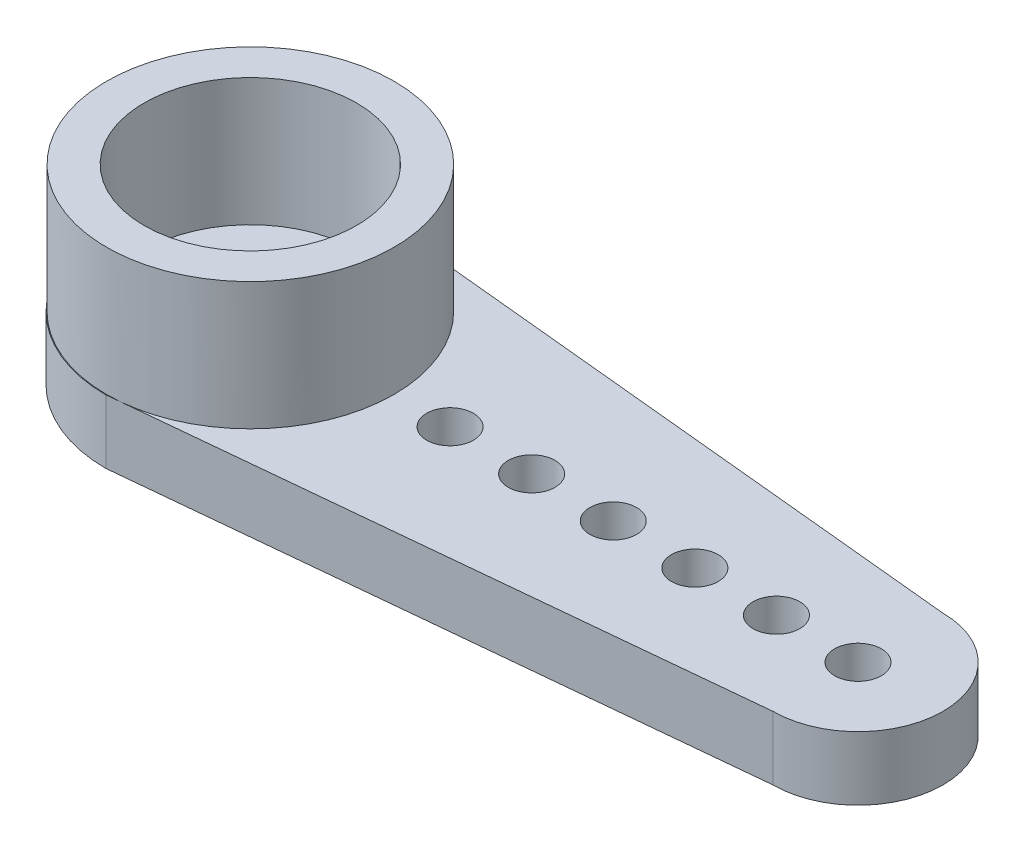
ISO-10303-21;
HEADER;
FILE_DESCRIPTION(('STEP AP214'),'2;1');
FILE_NAME('part.step','',(''),(''),'','','');
FILE_SCHEMA(('AUTOMOTIVE_DESIGN { 1 0 10303 214 1 1 1 1 }'));
ENDSEC;
DATA;
#1=APPLICATION_CONTEXT('core data for automotive mechanical design processes');
#2=APPLICATION_PROTOCOL_DEFINITION('international standard','automotive_design',2000,#1);
#3=PRODUCT_CONTEXT('',#1,'mechanical');
#4=PRODUCT('Part','Part','',(#3));
#5=PRODUCT_RELATED_PRODUCT_CATEGORY('part','',(#4));
#6=PRODUCT_DEFINITION_FORMATION('','',#4);
#7=PRODUCT_DEFINITION_CONTEXT('part definition',#1,'design');
#8=PRODUCT_DEFINITION('design','',#6,#7);
#9=PRODUCT_DEFINITION_SHAPE('','',#8);
#10=(LENGTH_UNIT() NAMED_UNIT(*) SI_UNIT(.MILLI.,.METRE.));
#11=(NAMED_UNIT(*) PLANE_ANGLE_UNIT() SI_UNIT($,.RADIAN.));
#12=(NAMED_UNIT(*) SI_UNIT($,.STERADIAN.) SOLID_ANGLE_UNIT());
#13=UNCERTAINTY_MEASURE_WITH_UNIT(LENGTH_MEASURE(1.E-05),#10,'distance_accuracy_value','');
#14=(GEOMETRIC_REPRESENTATION_CONTEXT(3) GLOBAL_UNCERTAINTY_ASSIGNED_CONTEXT((#13)) GLOBAL_UNIT_ASSIGNED_CONTEXT((#10,
#11,#12)) REPRESENTATION_CONTEXT('',''));
#15=CARTESIAN_POINT('',(0.,0.,0.));
#16=DIRECTION('',(0.,0.,1.));
#17=DIRECTION('',(1.,0.,0.));
#18=AXIS2_PLACEMENT_3D('',#15,#16,#17);
#19=CARTESIAN_POINT('',(-23.9406547992216,1.66417194875298,0.));
#20=DIRECTION('',(0.,1.,0.));
#21=DIRECTION('',(0.,0.,1.));
#22=AXIS2_PLACEMENT_3D('',#19,#20,#21);
#23=PLANE('',#22);
#24=CARTESIAN_POINT('',(5.26253029269123,1.66417194875298,0.));
#25=DIRECTION('',(0.,1.,0.));
#26=DIRECTION('',(0.,0.,1.));
#27=AXIS2_PLACEMENT_3D('',#24,#25,#26);
#28=CIRCLE('',#27,1.1);
#29=CARTESIAN_POINT('',(5.26253029269123,1.66417194875298,1.10000000000001));
#30=VERTEX_POINT('',#29);
#31=EDGE_CURVE('E306',#30,#30,#28,.T.);
#32=ORIENTED_EDGE('',*,*,#31,.F.);
#33=EDGE_LOOP('',(#32));
#34=FACE_BOUND('',#33,.T.);
#35=CARTESIAN_POINT('',(9.10253029269123,1.66417194875298,0.));
#36=DIRECTION('',(0.,1.,0.));
#37=DIRECTION('',(0.,0.,1.));
#38=AXIS2_PLACEMENT_3D('',#35,#36,#37);
#39=CIRCLE('',#38,1.1);
#40=CARTESIAN_POINT('',(9.10253029269123,1.66417194875298,1.1));
#41=VERTEX_POINT('',#40);
#42=EDGE_CURVE('E311',#41,#41,#39,.T.);
#43=ORIENTED_EDGE('',*,*,#42,.F.);
#44=EDGE_LOOP('',(#43));
#45=FACE_BOUND('',#44,.T.);
#46=CARTESIAN_POINT('',(12.9425302926912,1.66417194875298,0.));
#47=DIRECTION('',(0.,1.,0.));
#48=DIRECTION('',(0.,0.,1.));
#49=AXIS2_PLACEMENT_3D('',#46,#47,#48);
#50=CIRCLE('',#49,1.1);
#51=CARTESIAN_POINT('',(12.9425302926912,1.66417194875298,1.1));
#52=VERTEX_POINT('',#51);
#53=EDGE_CURVE('E315',#52,#52,#50,.T.);
#54=ORIENTED_EDGE('',*,*,#53,.F.);
#55=EDGE_LOOP('',(#54));
#56=FACE_BOUND('',#55,.T.);
#57=CARTESIAN_POINT('',(16.7825302926912,1.66417194875298,0.));
#58=DIRECTION('',(0.,1.,0.));
#59=DIRECTION('',(0.,0.,1.));
#60=AXIS2_PLACEMENT_3D('',#57,#58,#59);
#61=CIRCLE('',#60,1.1);
#62=CARTESIAN_POINT('',(16.7825302926912,1.66417194875298,1.1));
#63=VERTEX_POINT('',#62);
#64=EDGE_CURVE('E319',#63,#63,#61,.T.);
#65=ORIENTED_EDGE('',*,*,#64,.F.);
#66=EDGE_LOOP('',(#65));
#67=FACE_BOUND('',#66,.T.);
#68=CARTESIAN_POINT('',(20.6225302926912,1.66417194875298,0.));
#69=DIRECTION('',(0.,1.,0.));
#70=DIRECTION('',(0.,0.,1.));
#71=AXIS2_PLACEMENT_3D('',#68,#69,#70);
#72=CIRCLE('',#71,1.1);
#73=CARTESIAN_POINT('',(20.6225302926912,1.66417194875298,1.1));
#74=VERTEX_POINT('',#73);
#75=EDGE_CURVE('E323',#74,#74,#72,.T.);
#76=ORIENTED_EDGE('',*,*,#75,.F.);
#77=EDGE_LOOP('',(#76));
#78=FACE_BOUND('',#77,.T.);
#79=CARTESIAN_POINT('',(24.4625302926912,1.66417194875298,0.));
#80=DIRECTION('',(0.,1.,0.));
#81=DIRECTION('',(0.,0.,1.));
#82=AXIS2_PLACEMENT_3D('',#79,#80,#81);
#83=CIRCLE('',#82,1.1);
#84=CARTESIAN_POINT('',(24.4625302926912,1.66417194875298,1.1));
#85=VERTEX_POINT('',#84);
#86=EDGE_CURVE('E195',#85,#85,#83,.T.);
#87=ORIENTED_EDGE('',*,*,#86,.F.);
#88=EDGE_LOOP('',(#87));
#89=FACE_BOUND('',#88,.T.);
#90=CARTESIAN_POINT('',(-4.13746970730877,1.66417194875298,0.));
#91=DIRECTION('',(0.,1.,0.));
#92=DIRECTION('',(0.,0.,1.));
#93=AXIS2_PLACEMENT_3D('',#90,#91,#92);
#94=CIRCLE('',#93,6.76764401918097);
#95=CARTESIAN_POINT('',(-3.47805580563766,1.66417194875298,6.7354419956406));
#96=VERTEX_POINT('',#95);
#97=CARTESIAN_POINT('',(-3.47805580563766,1.66417194875298,-6.7354419956406));
#98=VERTEX_POINT('',#97);
#99=EDGE_CURVE('E97',#96,#98,#94,.T.);
#100=ORIENTED_EDGE('',*,*,#99,.F.);
#101=DIRECTION('',(0.995241767526614,0.,-0.0974362569606475));
#102=VECTOR('',#101,1.);
#103=CARTESIAN_POINT('',(-23.093232940272,1.66417194875298,8.65580898784256));
#104=LINE('',#103,#102);
#105=CARTESIAN_POINT('',(24.4625302926912,1.66417194875298,4.));
#106=VERTEX_POINT('',#105);
#107=EDGE_CURVE('E85',#96,#106,#104,.T.);
#108=ORIENTED_EDGE('',*,*,#107,.T.);
#109=CARTESIAN_POINT('',(24.4625302926912,1.66417194875298,0.));
#110=DIRECTION('',(0.,1.,0.));
#111=DIRECTION('',(0.,0.,1.));
#112=AXIS2_PLACEMENT_3D('',#109,#110,#111);
#113=CIRCLE('',#112,4.);
#114=CARTESIAN_POINT('',(24.4625302926912,1.66417194875298,-3.99999999999999));
#115=VERTEX_POINT('',#114);
#116=EDGE_CURVE('E93',#106,#115,#113,.T.);
#117=ORIENTED_EDGE('',*,*,#116,.T.);
#118=DIRECTION('',(0.995241767526614,0.,0.0974362569606479));
#119=VECTOR('',#118,1.);
#120=CARTESIAN_POINT('',(-23.093232940272,1.66417194875298,-8.65580898784256));
#121=LINE('',#120,#119);
#122=EDGE_CURVE('E98',#98,#115,#121,.T.);
#123=ORIENTED_EDGE('',*,*,#122,.F.);
#124=EDGE_LOOP('',(#100,#108,#117,#123));
#125=FACE_BOUND('',#124,.T.);
#126=ADVANCED_FACE('F35',(#34,#45,#56,#67,#78,#89,#125),#23,.T.);
#127=CARTESIAN_POINT('',(-23.093232940272,1.66417194875298,8.65580898784256));
#128=DIRECTION('',(-0.0974362569606475,0.,-0.995241767526614));
#129=DIRECTION('',(-0.995241767526614,0.,0.0974362569606475));
#130=AXIS2_PLACEMENT_3D('',#127,#128,#129);
#131=PLANE('',#130);
#132=ORIENTED_EDGE('',*,*,#107,.F.);
#133=CARTESIAN_POINT('',(-4.13746970730877,1.66417194875298,6.8));
#134=VERTEX_POINT('',#133);
#135=EDGE_CURVE('E90',#134,#96,#104,.T.);
#136=ORIENTED_EDGE('',*,*,#135,.F.);
#137=DIRECTION('',(0.,-1.,0.));
#138=VECTOR('',#137,1.);
#139=CARTESIAN_POINT('',(-4.13746970730877,1.66417194875298,6.8));
#140=LINE('',#139,#138);
#141=CARTESIAN_POINT('',(-4.13746970730877,-1.33582805124702,6.8));
#142=VERTEX_POINT('',#141);
#143=EDGE_CURVE('E115',#134,#142,#140,.T.);
#144=ORIENTED_EDGE('',*,*,#143,.T.);
#145=DIRECTION('',(0.995241767526614,0.,-0.0974362569606475));
#146=VECTOR('',#145,1.);
#147=CARTESIAN_POINT('',(-23.093232940272,-1.33582805124702,8.65580898784256));
#148=LINE('',#147,#146);
#149=CARTESIAN_POINT('',(24.4625302926912,-1.33582805124702,4.));
#150=VERTEX_POINT('',#149);
#151=EDGE_CURVE('E101',#142,#150,#148,.T.);
#152=ORIENTED_EDGE('',*,*,#151,.T.);
#153=DIRECTION('',(0.,-1.,0.));
#154=VECTOR('',#153,1.);
#155=CARTESIAN_POINT('',(24.4625302926912,1.66417194875298,4.));
#156=LINE('',#155,#154);
#157=EDGE_CURVE('E11',#106,#150,#156,.T.);
#158=ORIENTED_EDGE('',*,*,#157,.F.);
#159=EDGE_LOOP('',(#132,#136,#144,#152,#158));
#160=FACE_BOUND('',#159,.T.);
#161=ADVANCED_FACE('F37',(#160),#131,.F.);
#162=CARTESIAN_POINT('',(24.4625302926912,1.66417194875298,0.));
#163=DIRECTION('',(0.,-1.,0.));
#164=DIRECTION('',(0.,0.,-1.));
#165=AXIS2_PLACEMENT_3D('',#162,#163,#164);
#166=CYLINDRICAL_SURFACE('',#165,4.);
#167=CARTESIAN_POINT('',(24.4625302926912,-1.33582805124702,0.));
#168=DIRECTION('',(0.,1.,0.));
#169=DIRECTION('',(0.,0.,1.));
#170=AXIS2_PLACEMENT_3D('',#167,#168,#169);
#171=CIRCLE('',#170,4.);
#172=CARTESIAN_POINT('',(24.4625302926912,-1.33582805124702,-3.99999999999999));
#173=VERTEX_POINT('',#172);
#174=EDGE_CURVE('E117',#150,#173,#171,.T.);
#175=ORIENTED_EDGE('',*,*,#174,.T.);
#176=DIRECTION('',(0.,-1.,0.));
#177=VECTOR('',#176,1.);
#178=CARTESIAN_POINT('',(24.4625302926912,1.66417194875298,-3.99999999999999));
#179=LINE('',#178,#177);
#180=EDGE_CURVE('E43',#115,#173,#179,.T.);
#181=ORIENTED_EDGE('',*,*,#180,.F.);
#182=ORIENTED_EDGE('',*,*,#116,.F.);
#183=ORIENTED_EDGE('',*,*,#157,.T.);
#184=EDGE_LOOP('',(#175,#181,#182,#183));
#185=FACE_BOUND('',#184,.T.);
#186=ADVANCED_FACE('F132',(#185),#166,.T.);
#187=CARTESIAN_POINT('',(-23.093232940272,1.66417194875298,-8.65580898784256));
#188=DIRECTION('',(0.0974362569606478,0.,-0.995241767526614));
#189=DIRECTION('',(-0.995241767526614,0.,-0.0974362569606478));
#190=AXIS2_PLACEMENT_3D('',#187,#188,#189);
#191=PLANE('',#190);
#192=ORIENTED_EDGE('',*,*,#180,.T.);
#193=DIRECTION('',(0.995241767526614,0.,0.0974362569606479));
#194=VECTOR('',#193,1.);
#195=CARTESIAN_POINT('',(-23.093232940272,-1.33582805124702,-8.65580898784256));
#196=LINE('',#195,#194);
#197=CARTESIAN_POINT('',(-4.13746970730877,-1.33582805124702,-6.8));
#198=VERTEX_POINT('',#197);
#199=EDGE_CURVE('E120',#198,#173,#196,.T.);
#200=ORIENTED_EDGE('',*,*,#199,.F.);
#201=DIRECTION('',(0.,-1.,0.));
#202=VECTOR('',#201,1.);
#203=CARTESIAN_POINT('',(-4.13746970730877,1.66417194875298,-6.8));
#204=LINE('',#203,#202);
#205=CARTESIAN_POINT('',(-4.13746970730877,1.66417194875298,-6.8));
#206=VERTEX_POINT('',#205);
#207=EDGE_CURVE('E124',#206,#198,#204,.T.);
#208=ORIENTED_EDGE('',*,*,#207,.F.);
#209=EDGE_CURVE('E112',#206,#98,#121,.T.);
#210=ORIENTED_EDGE('',*,*,#209,.T.);
#211=ORIENTED_EDGE('',*,*,#122,.T.);
#212=EDGE_LOOP('',(#192,#200,#208,#210,#211));
#213=FACE_BOUND('',#212,.T.);
#214=ADVANCED_FACE('F129',(#213),#191,.T.);
#215=CARTESIAN_POINT('',(-4.13746970730877,1.66417194875298,0.));
#216=DIRECTION('',(0.,-1.,0.));
#217=DIRECTION('',(0.,0.,-1.));
#218=AXIS2_PLACEMENT_3D('',#215,#216,#217);
#219=CYLINDRICAL_SURFACE('',#218,6.8);
#220=CARTESIAN_POINT('',(-4.13746970730877,-1.33582805124702,0.));
#221=DIRECTION('',(0.,1.,0.));
#222=DIRECTION('',(0.,0.,1.));
#223=AXIS2_PLACEMENT_3D('',#220,#221,#222);
#224=CIRCLE('',#223,6.8);
#225=EDGE_CURVE('E77',#198,#142,#224,.T.);
#226=ORIENTED_EDGE('',*,*,#225,.T.);
#227=ORIENTED_EDGE('',*,*,#143,.F.);
#228=CARTESIAN_POINT('',(-4.13746970730877,1.66417194875298,0.));
#229=DIRECTION('',(0.,1.,0.));
#230=DIRECTION('',(0.,0.,1.));
#231=AXIS2_PLACEMENT_3D('',#228,#229,#230);
#232=CIRCLE('',#231,6.8);
#233=EDGE_CURVE('E56',#206,#134,#232,.T.);
#234=ORIENTED_EDGE('',*,*,#233,.F.);
#235=ORIENTED_EDGE('',*,*,#207,.T.);
#236=EDGE_LOOP('',(#226,#227,#234,#235));
#237=FACE_BOUND('',#236,.T.);
#238=ADVANCED_FACE('F136',(#237),#219,.T.);
#239=EDGE_CURVE('E50',#98,#96,#94,.T.);
#240=ORIENTED_EDGE('',*,*,#239,.F.);
#241=ORIENTED_EDGE('',*,*,#209,.F.);
#242=ORIENTED_EDGE('',*,*,#233,.T.);
#243=ORIENTED_EDGE('',*,*,#135,.T.);
#244=EDGE_LOOP('',(#240,#241,#242,#243));
#245=FACE_BOUND('',#244,.T.);
#246=ADVANCED_FACE('F91',(#245),#23,.T.);
#247=CARTESIAN_POINT('',(-23.9406547992216,-1.33582805124702,0.));
#248=DIRECTION('',(0.,1.,0.));
#249=DIRECTION('',(0.,0.,1.));
#250=AXIS2_PLACEMENT_3D('',#247,#248,#249);
#251=PLANE('',#250);
#252=CARTESIAN_POINT('',(5.26253029269123,-1.33582805124702,0.));
#253=DIRECTION('',(0.,-1.,0.));
#254=DIRECTION('',(0.,0.,-1.));
#255=AXIS2_PLACEMENT_3D('',#252,#253,#254);
#256=CIRCLE('',#255,1.1);
#257=CARTESIAN_POINT('',(5.26253029269123,-1.33582805124702,-1.1));
#258=VERTEX_POINT('',#257);
#259=EDGE_CURVE('E164',#258,#258,#256,.T.);
#260=ORIENTED_EDGE('',*,*,#259,.F.);
#261=EDGE_LOOP('',(#260));
#262=FACE_BOUND('',#261,.T.);
#263=CARTESIAN_POINT('',(9.10253029269123,-1.33582805124702,0.));
#264=DIRECTION('',(0.,-1.,0.));
#265=DIRECTION('',(0.,0.,-1.));
#266=AXIS2_PLACEMENT_3D('',#263,#264,#265);
#267=CIRCLE('',#266,1.1);
#268=CARTESIAN_POINT('',(9.10253029269123,-1.33582805124702,-1.1));
#269=VERTEX_POINT('',#268);
#270=EDGE_CURVE('E168',#269,#269,#267,.T.);
#271=ORIENTED_EDGE('',*,*,#270,.F.);
#272=EDGE_LOOP('',(#271));
#273=FACE_BOUND('',#272,.T.);
#274=CARTESIAN_POINT('',(12.9425302926912,-1.33582805124702,0.));
#275=DIRECTION('',(0.,-1.,0.));
#276=DIRECTION('',(0.,0.,-1.));
#277=AXIS2_PLACEMENT_3D('',#274,#275,#276);
#278=CIRCLE('',#277,1.1);
#279=CARTESIAN_POINT('',(12.9425302926912,-1.33582805124702,-1.1));
#280=VERTEX_POINT('',#279);
#281=EDGE_CURVE('E172',#280,#280,#278,.T.);
#282=ORIENTED_EDGE('',*,*,#281,.F.);
#283=EDGE_LOOP('',(#282));
#284=FACE_BOUND('',#283,.T.);
#285=CARTESIAN_POINT('',(16.7825302926912,-1.33582805124702,0.));
#286=DIRECTION('',(0.,-1.,0.));
#287=DIRECTION('',(0.,0.,-1.));
#288=AXIS2_PLACEMENT_3D('',#285,#286,#287);
#289=CIRCLE('',#288,1.1);
#290=CARTESIAN_POINT('',(16.7825302926912,-1.33582805124702,-1.1));
#291=VERTEX_POINT('',#290);
#292=EDGE_CURVE('E176',#291,#291,#289,.T.);
#293=ORIENTED_EDGE('',*,*,#292,.F.);
#294=EDGE_LOOP('',(#293));
#295=FACE_BOUND('',#294,.T.);
#296=CARTESIAN_POINT('',(20.6225302926912,-1.33582805124702,0.));
#297=DIRECTION('',(0.,-1.,0.));
#298=DIRECTION('',(0.,0.,-1.));
#299=AXIS2_PLACEMENT_3D('',#296,#297,#298);
#300=CIRCLE('',#299,1.1);
#301=CARTESIAN_POINT('',(20.6225302926912,-1.33582805124702,-1.1));
#302=VERTEX_POINT('',#301);
#303=EDGE_CURVE('E180',#302,#302,#300,.T.);
#304=ORIENTED_EDGE('',*,*,#303,.F.);
#305=EDGE_LOOP('',(#304));
#306=FACE_BOUND('',#305,.T.);
#307=CARTESIAN_POINT('',(24.4625302926912,-1.33582805124702,0.));
#308=DIRECTION('',(0.,-1.,0.));
#309=DIRECTION('',(0.,0.,-1.));
#310=AXIS2_PLACEMENT_3D('',#307,#308,#309);
#311=CIRCLE('',#310,1.1);
#312=CARTESIAN_POINT('',(24.4625302926912,-1.33582805124702,-1.1));
#313=VERTEX_POINT('',#312);
#314=EDGE_CURVE('E184',#313,#313,#311,.T.);
#315=ORIENTED_EDGE('',*,*,#314,.F.);
#316=EDGE_LOOP('',(#315));
#317=FACE_BOUND('',#316,.T.);
#318=CARTESIAN_POINT('',(-4.13746970730877,-1.33582805124702,0.));
#319=DIRECTION('',(0.,1.,0.));
#320=DIRECTION('',(0.,0.,1.));
#321=AXIS2_PLACEMENT_3D('',#318,#319,#320);
#322=CIRCLE('',#321,2.);
#323=CARTESIAN_POINT('',(-4.13746970730877,-1.33582805124702,2.));
#324=VERTEX_POINT('',#323);
#325=EDGE_CURVE('E187',#324,#324,#322,.T.);
#326=ORIENTED_EDGE('',*,*,#325,.T.);
#327=EDGE_LOOP('',(#326));
#328=FACE_BOUND('',#327,.T.);
#329=ORIENTED_EDGE('',*,*,#199,.T.);
#330=ORIENTED_EDGE('',*,*,#174,.F.);
#331=ORIENTED_EDGE('',*,*,#151,.F.);
#332=ORIENTED_EDGE('',*,*,#225,.F.);
#333=EDGE_LOOP('',(#329,#330,#331,#332));
#334=FACE_BOUND('',#333,.T.);
#335=ADVANCED_FACE('F135',(#262,#273,#284,#295,#306,#317,#328,#334),#251,.F.);
#336=CARTESIAN_POINT('',(-4.13746970730877,7.66417194875298,0.));
#337=DIRECTION('',(0.,-1.,0.));
#338=DIRECTION('',(0.,0.,-1.));
#339=AXIS2_PLACEMENT_3D('',#336,#337,#338);
#340=CYLINDRICAL_SURFACE('',#339,6.76764401918097);
#341=ORIENTED_EDGE('',*,*,#239,.T.);
#342=ORIENTED_EDGE('',*,*,#99,.T.);
#343=EDGE_LOOP('',(#341,#342));
#344=FACE_BOUND('',#343,.T.);
#345=CARTESIAN_POINT('',(-4.13746970730877,7.66417194875298,0.));
#346=DIRECTION('',(0.,-1.,0.));
#347=DIRECTION('',(0.,0.,-1.));
#348=AXIS2_PLACEMENT_3D('',#345,#346,#347);
#349=CIRCLE('',#348,6.76764401918097);
#350=CARTESIAN_POINT('',(-4.13746970730877,7.66417194875298,-6.76764401918097));
#351=VERTEX_POINT('',#350);
#352=EDGE_CURVE('E105',#351,#351,#349,.T.);
#353=ORIENTED_EDGE('',*,*,#352,.T.);
#354=EDGE_LOOP('',(#353));
#355=FACE_BOUND('',#354,.T.);
#356=ADVANCED_FACE('F103',(#344,#355),#340,.T.);
#357=CARTESIAN_POINT('',(-4.13746970730877,7.66417194875298,0.));
#358=DIRECTION('',(0.,-1.,0.));
#359=DIRECTION('',(0.,0.,-1.));
#360=AXIS2_PLACEMENT_3D('',#357,#358,#359);
#361=PLANE('',#360);
#362=CARTESIAN_POINT('',(-4.13746970730877,7.66417194875298,0.));
#363=DIRECTION('',(0.,1.,0.));
#364=DIRECTION('',(0.,0.,1.));
#365=AXIS2_PLACEMENT_3D('',#362,#363,#364);
#366=CIRCLE('',#365,5.);
#367=CARTESIAN_POINT('',(-4.13746970730877,7.66417194875298,5.));
#368=VERTEX_POINT('',#367);
#369=EDGE_CURVE('E189',#368,#368,#366,.T.);
#370=ORIENTED_EDGE('',*,*,#369,.F.);
#371=EDGE_LOOP('',(#370));
#372=FACE_BOUND('',#371,.T.);
#373=ORIENTED_EDGE('',*,*,#352,.F.);
#374=EDGE_LOOP('',(#373));
#375=FACE_BOUND('',#374,.T.);
#376=ADVANCED_FACE('F160',(#372,#375),#361,.F.);
#377=CARTESIAN_POINT('',(-4.13746970730877,-12.477963674978,0.));
#378=DIRECTION('',(0.,1.,0.));
#379=DIRECTION('',(0.,0.,1.));
#380=AXIS2_PLACEMENT_3D('',#377,#378,#379);
#381=CYLINDRICAL_SURFACE('',#380,5.);
#382=CARTESIAN_POINT('',(-4.13746970730877,1.66417194875299,0.));
#383=DIRECTION('',(0.,1.,0.));
#384=DIRECTION('',(0.,0.,1.));
#385=AXIS2_PLACEMENT_3D('',#382,#383,#384);
#386=CIRCLE('',#385,5.);
#387=CARTESIAN_POINT('',(-4.13746970730877,1.66417194875299,5.));
#388=VERTEX_POINT('',#387);
#389=EDGE_CURVE('E107',#388,#388,#386,.F.);
#390=ORIENTED_EDGE('',*,*,#389,.T.);
#391=EDGE_LOOP('',(#390));
#392=FACE_BOUND('',#391,.T.);
#393=ORIENTED_EDGE('',*,*,#369,.T.);
#394=EDGE_LOOP('',(#393));
#395=FACE_BOUND('',#394,.T.);
#396=ADVANCED_FACE('F201',(#392,#395),#381,.F.);
#397=CARTESIAN_POINT('',(-23.9406547992216,1.66417194875298,0.));
#398=DIRECTION('',(0.,1.,0.));
#399=DIRECTION('',(0.,0.,1.));
#400=AXIS2_PLACEMENT_3D('',#397,#398,#399);
#401=PLANE('',#400);
#402=CARTESIAN_POINT('',(-4.13746970730877,1.66417194875298,0.));
#403=DIRECTION('',(0.,1.,0.));
#404=DIRECTION('',(0.,0.,1.));
#405=AXIS2_PLACEMENT_3D('',#402,#403,#404);
#406=CIRCLE('',#405,2.);
#407=CARTESIAN_POINT('',(-4.13746970730877,1.66417194875298,2.));
#408=VERTEX_POINT('',#407);
#409=EDGE_CURVE('E190',#408,#408,#406,.T.);
#410=ORIENTED_EDGE('',*,*,#409,.F.);
#411=EDGE_LOOP('',(#410));
#412=FACE_BOUND('',#411,.T.);
#413=ORIENTED_EDGE('',*,*,#389,.F.);
#414=EDGE_LOOP('',(#413));
#415=FACE_BOUND('',#414,.T.);
#416=ADVANCED_FACE('F204',(#412,#415),#401,.T.);
#417=CARTESIAN_POINT('',(-4.13746970730877,-5.33582805124702,0.));
#418=DIRECTION('',(0.,1.,0.));
#419=DIRECTION('',(0.,0.,1.));
#420=AXIS2_PLACEMENT_3D('',#417,#418,#419);
#421=CYLINDRICAL_SURFACE('',#420,2.);
#422=ORIENTED_EDGE('',*,*,#409,.T.);
#423=EDGE_LOOP('',(#422));
#424=FACE_BOUND('',#423,.T.);
#425=ORIENTED_EDGE('',*,*,#325,.F.);
#426=EDGE_LOOP('',(#425));
#427=FACE_BOUND('',#426,.T.);
#428=ADVANCED_FACE('F206',(#424,#427),#421,.F.);
#429=CARTESIAN_POINT('',(24.4625302926912,5.66417194875299,0.));
#430=DIRECTION('',(0.,-1.,0.));
#431=DIRECTION('',(0.,0.,-1.));
#432=AXIS2_PLACEMENT_3D('',#429,#430,#431);
#433=CYLINDRICAL_SURFACE('',#432,1.1);
#434=ORIENTED_EDGE('',*,*,#86,.T.);
#435=EDGE_LOOP('',(#434));
#436=FACE_BOUND('',#435,.T.);
#437=ORIENTED_EDGE('',*,*,#314,.T.);
#438=EDGE_LOOP('',(#437));
#439=FACE_BOUND('',#438,.T.);
#440=ADVANCED_FACE('F213',(#436,#439),#433,.F.);
#441=CARTESIAN_POINT('',(20.6225302926912,5.66417194875299,0.));
#442=DIRECTION('',(0.,-1.,0.));
#443=DIRECTION('',(0.,0.,-1.));
#444=AXIS2_PLACEMENT_3D('',#441,#442,#443);
#445=CYLINDRICAL_SURFACE('',#444,1.1);
#446=ORIENTED_EDGE('',*,*,#75,.T.);
#447=EDGE_LOOP('',(#446));
#448=FACE_BOUND('',#447,.T.);
#449=ORIENTED_EDGE('',*,*,#303,.T.);
#450=EDGE_LOOP('',(#449));
#451=FACE_BOUND('',#450,.T.);
#452=ADVANCED_FACE('F251',(#448,#451),#445,.F.);
#453=CARTESIAN_POINT('',(16.7825302926912,5.66417194875299,0.));
#454=DIRECTION('',(0.,-1.,0.));
#455=DIRECTION('',(0.,0.,-1.));
#456=AXIS2_PLACEMENT_3D('',#453,#454,#455);
#457=CYLINDRICAL_SURFACE('',#456,1.1);
#458=ORIENTED_EDGE('',*,*,#64,.T.);
#459=EDGE_LOOP('',(#458));
#460=FACE_BOUND('',#459,.T.);
#461=ORIENTED_EDGE('',*,*,#292,.T.);
#462=EDGE_LOOP('',(#461));
#463=FACE_BOUND('',#462,.T.);
#464=ADVANCED_FACE('F260',(#460,#463),#457,.F.);
#465=CARTESIAN_POINT('',(12.9425302926912,5.66417194875299,0.));
#466=DIRECTION('',(0.,-1.,0.));
#467=DIRECTION('',(0.,0.,-1.));
#468=AXIS2_PLACEMENT_3D('',#465,#466,#467);
#469=CYLINDRICAL_SURFACE('',#468,1.1);
#470=ORIENTED_EDGE('',*,*,#53,.T.);
#471=EDGE_LOOP('',(#470));
#472=FACE_BOUND('',#471,.T.);
#473=ORIENTED_EDGE('',*,*,#281,.T.);
#474=EDGE_LOOP('',(#473));
#475=FACE_BOUND('',#474,.T.);
#476=ADVANCED_FACE('F270',(#472,#475),#469,.F.);
#477=CARTESIAN_POINT('',(9.10253029269123,5.66417194875299,0.));
#478=DIRECTION('',(0.,-1.,0.));
#479=DIRECTION('',(0.,0.,-1.));
#480=AXIS2_PLACEMENT_3D('',#477,#478,#479);
#481=CYLINDRICAL_SURFACE('',#480,1.1);
#482=ORIENTED_EDGE('',*,*,#42,.T.);
#483=EDGE_LOOP('',(#482));
#484=FACE_BOUND('',#483,.T.);
#485=ORIENTED_EDGE('',*,*,#270,.T.);
#486=EDGE_LOOP('',(#485));
#487=FACE_BOUND('',#486,.T.);
#488=ADVANCED_FACE('F280',(#484,#487),#481,.F.);
#489=CARTESIAN_POINT('',(5.26253029269123,5.66417194875299,0.));
#490=DIRECTION('',(0.,-1.,0.));
#491=DIRECTION('',(0.,0.,-1.));
#492=AXIS2_PLACEMENT_3D('',#489,#490,#491);
#493=CYLINDRICAL_SURFACE('',#492,1.1);
#494=ORIENTED_EDGE('',*,*,#31,.T.);
#495=EDGE_LOOP('',(#494));
#496=FACE_BOUND('',#495,.T.);
#497=ORIENTED_EDGE('',*,*,#259,.T.);
#498=EDGE_LOOP('',(#497));
#499=FACE_BOUND('',#498,.T.);
#500=ADVANCED_FACE('F290',(#496,#499),#493,.F.);
#501=CLOSED_SHELL('',(#126,#161,#186,#214,#238,#246,#335,#356,#376,#396,#416,#428,#440,#452,
#464,#476,#488,#500));
#502=MANIFOLD_SOLID_BREP('B2',#501);
#503=ADVANCED_BREP_SHAPE_REPRESENTATION('',(#18,#502),#14);
#504=SHAPE_DEFINITION_REPRESENTATION(#9,#503);
ENDSEC;
END-ISO-10303-21;
